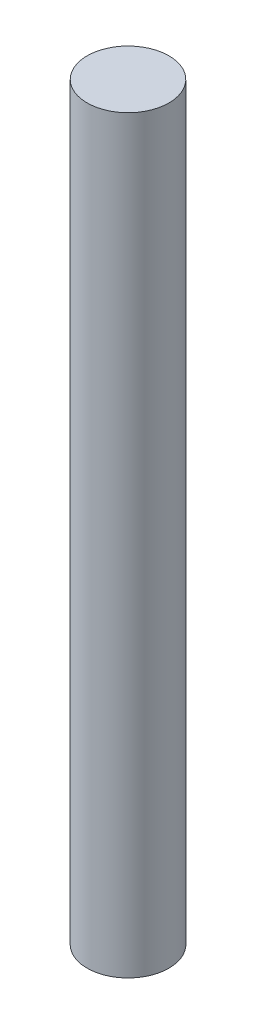
ISO-10303-21;
HEADER;
FILE_DESCRIPTION(('STEP AP214'),'2;1');
FILE_NAME('part.step','',(''),(''),'','','');
FILE_SCHEMA(('AUTOMOTIVE_DESIGN { 1 0 10303 214 1 1 1 1 }'));
ENDSEC;
DATA;
#1=APPLICATION_CONTEXT('core data for automotive mechanical design processes');
#2=APPLICATION_PROTOCOL_DEFINITION('international standard','automotive_design',2000,#1);
#3=PRODUCT_CONTEXT('',#1,'mechanical');
#4=PRODUCT('Part','Part','',(#3));
#5=PRODUCT_RELATED_PRODUCT_CATEGORY('part','',(#4));
#6=PRODUCT_DEFINITION_FORMATION('','',#4);
#7=PRODUCT_DEFINITION_CONTEXT('part definition',#1,'design');
#8=PRODUCT_DEFINITION('design','',#6,#7);
#9=PRODUCT_DEFINITION_SHAPE('','',#8);
#10=(LENGTH_UNIT() NAMED_UNIT(*) SI_UNIT(.MILLI.,.METRE.));
#11=(NAMED_UNIT(*) PLANE_ANGLE_UNIT() SI_UNIT($,.RADIAN.));
#12=(NAMED_UNIT(*) SI_UNIT($,.STERADIAN.) SOLID_ANGLE_UNIT());
#13=UNCERTAINTY_MEASURE_WITH_UNIT(LENGTH_MEASURE(1.E-05),#10,'distance_accuracy_value','');
#14=(GEOMETRIC_REPRESENTATION_CONTEXT(3) GLOBAL_UNCERTAINTY_ASSIGNED_CONTEXT((#13)) GLOBAL_UNIT_ASSIGNED_CONTEXT((#10,
#11,#12)) REPRESENTATION_CONTEXT('',''));
#15=CARTESIAN_POINT('',(0.,0.,0.));
#16=DIRECTION('',(0.,0.,1.));
#17=DIRECTION('',(1.,0.,0.));
#18=AXIS2_PLACEMENT_3D('',#15,#16,#17);
#19=CARTESIAN_POINT('',(0.,0.,0.));
#20=DIRECTION('',(0.,-1.,0.));
#21=DIRECTION('',(1.,0.,0.));
#22=AXIS2_PLACEMENT_3D('',#19,#20,#21);
#23=PLANE('',#22);
#24=CARTESIAN_POINT('',(0.,0.,0.));
#25=DIRECTION('',(0.,-1.,0.));
#26=DIRECTION('',(1.,0.,0.));
#27=AXIS2_PLACEMENT_3D('',#24,#25,#26);
#28=CIRCLE('',#27,3.);
#29=CARTESIAN_POINT('',(3.,0.,0.));
#30=VERTEX_POINT('',#29);
#31=EDGE_CURVE('E10',#30,#30,#28,.T.);
#32=ORIENTED_EDGE('',*,*,#31,.F.);
#33=EDGE_LOOP('',(#32));
#34=FACE_BOUND('',#33,.T.);
#35=ADVANCED_FACE('F33',(#34),#23,.F.);
#36=CARTESIAN_POINT('',(0.,-55.,0.));
#37=DIRECTION('',(0.,-1.,0.));
#38=DIRECTION('',(1.,0.,0.));
#39=AXIS2_PLACEMENT_3D('',#36,#37,#38);
#40=CYLINDRICAL_SURFACE('',#39,3.);
#41=CARTESIAN_POINT('',(0.,-55.,0.));
#42=DIRECTION('',(0.,-1.,0.));
#43=DIRECTION('',(1.,0.,0.));
#44=AXIS2_PLACEMENT_3D('',#41,#42,#43);
#45=CIRCLE('',#44,3.);
#46=CARTESIAN_POINT('',(3.00000000000001,-55.,0.));
#47=VERTEX_POINT('',#46);
#48=EDGE_CURVE('E39',#47,#47,#45,.T.);
#49=ORIENTED_EDGE('',*,*,#48,.F.);
#50=EDGE_LOOP('',(#49));
#51=FACE_BOUND('',#50,.T.);
#52=ORIENTED_EDGE('',*,*,#31,.T.);
#53=EDGE_LOOP('',(#52));
#54=FACE_BOUND('',#53,.T.);
#55=ADVANCED_FACE('F47',(#51,#54),#40,.T.);
#56=CARTESIAN_POINT('',(-3.,-55.,0.));
#57=DIRECTION('',(0.,1.,0.));
#58=DIRECTION('',(-1.,0.,0.));
#59=AXIS2_PLACEMENT_3D('',#56,#57,#58);
#60=PLANE('',#59);
#61=ORIENTED_EDGE('',*,*,#48,.T.);
#62=EDGE_LOOP('',(#61));
#63=FACE_BOUND('',#62,.T.);
#64=ADVANCED_FACE('F45',(#63),#60,.F.);
#65=CLOSED_SHELL('',(#35,#55,#64));
#66=MANIFOLD_SOLID_BREP('B2',#65);
#67=ADVANCED_BREP_SHAPE_REPRESENTATION('',(#18,#66),#14);
#68=SHAPE_DEFINITION_REPRESENTATION(#9,#67);
ENDSEC;
END-ISO-10303-21;
